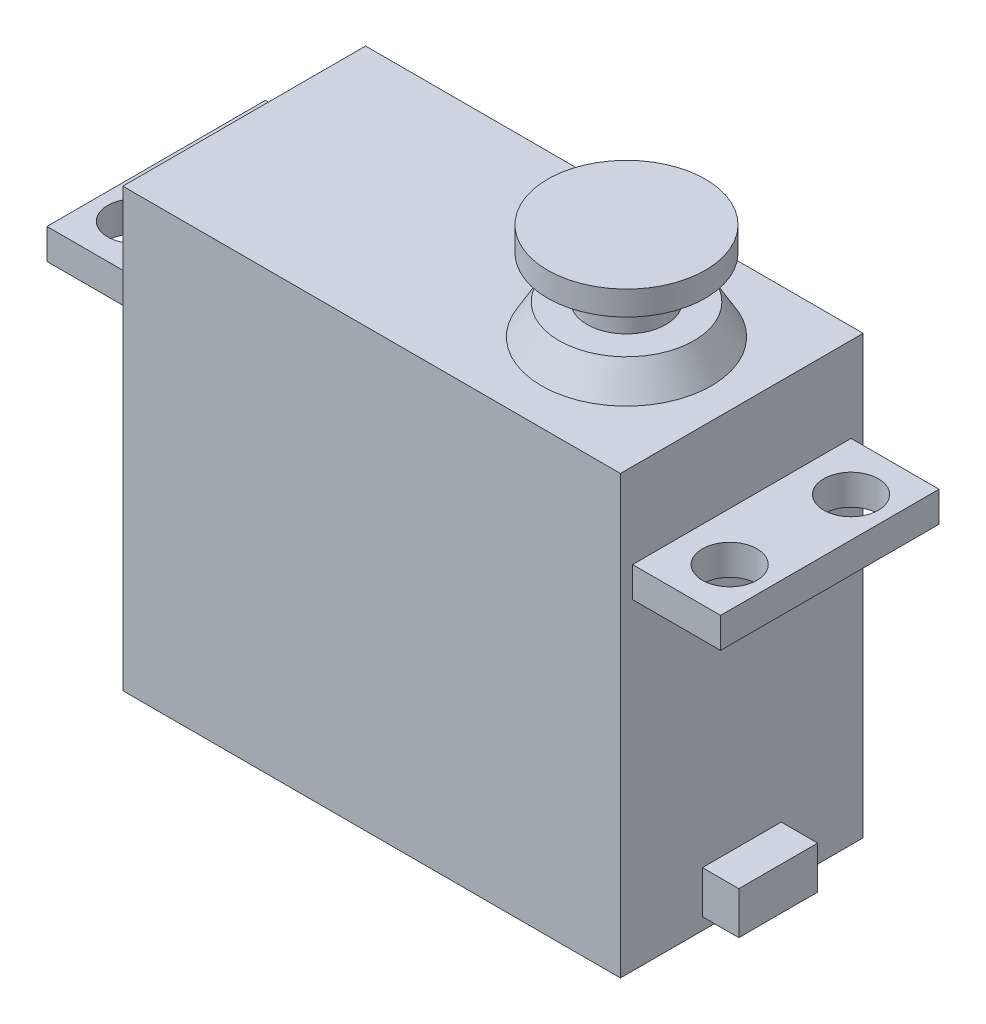
ISO-10303-21;
HEADER;
FILE_DESCRIPTION(('STEP AP214'),'2;1');
FILE_NAME('part.step','',(''),(''),'','','');
FILE_SCHEMA(('AUTOMOTIVE_DESIGN { 1 0 10303 214 1 1 1 1 }'));
ENDSEC;
DATA;
#1=APPLICATION_CONTEXT('core data for automotive mechanical design processes');
#2=APPLICATION_PROTOCOL_DEFINITION('international standard','automotive_design',2000,#1);
#3=PRODUCT_CONTEXT('',#1,'mechanical');
#4=PRODUCT('Part','Part','',(#3));
#5=PRODUCT_RELATED_PRODUCT_CATEGORY('part','',(#4));
#6=PRODUCT_DEFINITION_FORMATION('','',#4);
#7=PRODUCT_DEFINITION_CONTEXT('part definition',#1,'design');
#8=PRODUCT_DEFINITION('design','',#6,#7);
#9=PRODUCT_DEFINITION_SHAPE('','',#8);
#10=(LENGTH_UNIT() NAMED_UNIT(*) SI_UNIT(.MILLI.,.METRE.));
#11=(NAMED_UNIT(*) PLANE_ANGLE_UNIT() SI_UNIT($,.RADIAN.));
#12=(NAMED_UNIT(*) SI_UNIT($,.STERADIAN.) SOLID_ANGLE_UNIT());
#13=UNCERTAINTY_MEASURE_WITH_UNIT(LENGTH_MEASURE(1.E-05),#10,'distance_accuracy_value','');
#14=(GEOMETRIC_REPRESENTATION_CONTEXT(3) GLOBAL_UNCERTAINTY_ASSIGNED_CONTEXT((#13)) GLOBAL_UNIT_ASSIGNED_CONTEXT((#10,
#11,#12)) REPRESENTATION_CONTEXT('',''));
#15=CARTESIAN_POINT('',(0.,0.,0.));
#16=DIRECTION('',(0.,0.,1.));
#17=DIRECTION('',(1.,0.,0.));
#18=AXIS2_PLACEMENT_3D('',#15,#16,#17);
#19=CARTESIAN_POINT('',(11.,44.,0.));
#20=DIRECTION('',(0.,-1.,0.));
#21=DIRECTION('',(0.,0.,-1.));
#22=AXIS2_PLACEMENT_3D('',#19,#20,#21);
#23=CYLINDRICAL_SURFACE('',#22,3.25);
#24=CARTESIAN_POINT('',(11.,38.5,0.));
#25=DIRECTION('',(0.,1.,0.));
#26=DIRECTION('',(0.,0.,1.));
#27=AXIS2_PLACEMENT_3D('',#24,#25,#26);
#28=CIRCLE('',#27,3.25);
#29=CARTESIAN_POINT('',(11.,38.5,3.25));
#30=VERTEX_POINT('',#29);
#31=EDGE_CURVE('E269',#30,#30,#28,.F.);
#32=ORIENTED_EDGE('',*,*,#31,.F.);
#33=EDGE_LOOP('',(#32));
#34=FACE_BOUND('',#33,.T.);
#35=CARTESIAN_POINT('',(11.,42.,0.));
#36=DIRECTION('',(0.,1.,0.));
#37=DIRECTION('',(0.,0.,1.));
#38=AXIS2_PLACEMENT_3D('',#35,#36,#37);
#39=CIRCLE('',#38,3.25);
#40=CARTESIAN_POINT('',(11.,42.,3.25));
#41=VERTEX_POINT('',#40);
#42=EDGE_CURVE('E11',#41,#41,#39,.T.);
#43=ORIENTED_EDGE('',*,*,#42,.F.);
#44=EDGE_LOOP('',(#43));
#45=FACE_BOUND('',#44,.T.);
#46=ADVANCED_FACE('F38',(#34,#45),#23,.T.);
#47=CARTESIAN_POINT('',(20.5,36.,10.));
#48=DIRECTION('',(-1.,0.,0.));
#49=DIRECTION('',(0.,0.,1.));
#50=AXIS2_PLACEMENT_3D('',#47,#48,#49);
#51=PLANE('',#50);
#52=DIRECTION('',(0.,0.,1.));
#53=VECTOR('',#52,1.);
#54=CARTESIAN_POINT('',(20.5,29.,10.));
#55=LINE('',#54,#53);
#56=CARTESIAN_POINT('',(20.5,29.,-9.));
#57=VERTEX_POINT('',#56);
#58=CARTESIAN_POINT('',(20.5,29.,9.));
#59=VERTEX_POINT('',#58);
#60=EDGE_CURVE('E219',#57,#59,#55,.T.);
#61=ORIENTED_EDGE('',*,*,#60,.F.);
#62=DIRECTION('',(0.,-1.,0.));
#63=VECTOR('',#62,1.);
#64=CARTESIAN_POINT('',(20.5,36.,-9.));
#65=LINE('',#64,#63);
#66=CARTESIAN_POINT('',(20.5,26.5,-9.));
#67=VERTEX_POINT('',#66);
#68=EDGE_CURVE('E224',#57,#67,#65,.T.);
#69=ORIENTED_EDGE('',*,*,#68,.T.);
#70=DIRECTION('',(0.,0.,1.));
#71=VECTOR('',#70,1.);
#72=CARTESIAN_POINT('',(20.5,26.5,10.));
#73=LINE('',#72,#71);
#74=CARTESIAN_POINT('',(20.5,26.5,9.));
#75=VERTEX_POINT('',#74);
#76=EDGE_CURVE('E210',#67,#75,#73,.T.);
#77=ORIENTED_EDGE('',*,*,#76,.T.);
#78=DIRECTION('',(0.,1.,0.));
#79=VECTOR('',#78,1.);
#80=CARTESIAN_POINT('',(20.5,36.,9.));
#81=LINE('',#80,#79);
#82=EDGE_CURVE('E221',#75,#59,#81,.T.);
#83=ORIENTED_EDGE('',*,*,#82,.T.);
#84=EDGE_LOOP('',(#61,#69,#77,#83));
#85=FACE_BOUND('',#84,.T.);
#86=DIRECTION('',(0.,0.,-1.));
#87=VECTOR('',#86,1.);
#88=CARTESIAN_POINT('',(20.5,0.,10.));
#89=LINE('',#88,#87);
#90=CARTESIAN_POINT('',(20.5,0.,10.));
#91=VERTEX_POINT('',#90);
#92=CARTESIAN_POINT('',(20.5,0.,-10.));
#93=VERTEX_POINT('',#92);
#94=EDGE_CURVE('E243',#91,#93,#89,.T.);
#95=ORIENTED_EDGE('',*,*,#94,.T.);
#96=DIRECTION('',(0.,-1.,0.));
#97=VECTOR('',#96,1.);
#98=CARTESIAN_POINT('',(20.5,36.,-10.));
#99=LINE('',#98,#97);
#100=CARTESIAN_POINT('',(20.5,36.,-10.));
#101=VERTEX_POINT('',#100);
#102=EDGE_CURVE('E254',#101,#93,#99,.T.);
#103=ORIENTED_EDGE('',*,*,#102,.F.);
#104=DIRECTION('',(0.,0.,-1.));
#105=VECTOR('',#104,1.);
#106=CARTESIAN_POINT('',(20.5,36.,10.));
#107=LINE('',#106,#105);
#108=CARTESIAN_POINT('',(20.5,36.,10.));
#109=VERTEX_POINT('',#108);
#110=EDGE_CURVE('E231',#109,#101,#107,.T.);
#111=ORIENTED_EDGE('',*,*,#110,.F.);
#112=DIRECTION('',(0.,-1.,0.));
#113=VECTOR('',#112,1.);
#114=CARTESIAN_POINT('',(20.5,36.,10.));
#115=LINE('',#114,#113);
#116=EDGE_CURVE('E256',#109,#91,#115,.T.);
#117=ORIENTED_EDGE('',*,*,#116,.T.);
#118=EDGE_LOOP('',(#95,#103,#111,#117));
#119=FACE_BOUND('',#118,.T.);
#120=DIRECTION('',(0.,1.,0.));
#121=VECTOR('',#120,1.);
#122=CARTESIAN_POINT('',(20.5,1.,-3.25));
#123=LINE('',#122,#121);
#124=CARTESIAN_POINT('',(20.5,1.,-3.25));
#125=VERTEX_POINT('',#124);
#126=CARTESIAN_POINT('',(20.5,4.5,-3.25));
#127=VERTEX_POINT('',#126);
#128=EDGE_CURVE('E173',#125,#127,#123,.T.);
#129=ORIENTED_EDGE('',*,*,#128,.F.);
#130=DIRECTION('',(0.,0.,-1.));
#131=VECTOR('',#130,1.);
#132=CARTESIAN_POINT('',(20.5,1.,3.25));
#133=LINE('',#132,#131);
#134=CARTESIAN_POINT('',(20.5,1.,3.25));
#135=VERTEX_POINT('',#134);
#136=EDGE_CURVE('E170',#135,#125,#133,.T.);
#137=ORIENTED_EDGE('',*,*,#136,.F.);
#138=DIRECTION('',(0.,-1.,0.));
#139=VECTOR('',#138,1.);
#140=CARTESIAN_POINT('',(20.5,1.,3.25));
#141=LINE('',#140,#139);
#142=CARTESIAN_POINT('',(20.5,4.5,3.25));
#143=VERTEX_POINT('',#142);
#144=EDGE_CURVE('E60',#143,#135,#141,.T.);
#145=ORIENTED_EDGE('',*,*,#144,.F.);
#146=DIRECTION('',(0.,0.,1.));
#147=VECTOR('',#146,1.);
#148=CARTESIAN_POINT('',(20.5,4.5,3.25));
#149=LINE('',#148,#147);
#150=EDGE_CURVE('E55',#127,#143,#149,.T.);
#151=ORIENTED_EDGE('',*,*,#150,.F.);
#152=EDGE_LOOP('',(#129,#137,#145,#151));
#153=FACE_BOUND('',#152,.T.);
#154=ADVANCED_FACE('F324',(#85,#119,#153),#51,.F.);
#155=CARTESIAN_POINT('',(-20.5,36.,10.));
#156=DIRECTION('',(-1.,0.,0.));
#157=DIRECTION('',(0.,0.,1.));
#158=AXIS2_PLACEMENT_3D('',#155,#156,#157);
#159=PLANE('',#158);
#160=DIRECTION('',(0.,0.,-1.));
#161=VECTOR('',#160,1.);
#162=CARTESIAN_POINT('',(-20.5,0.,10.));
#163=LINE('',#162,#161);
#164=CARTESIAN_POINT('',(-20.5,0.,10.));
#165=VERTEX_POINT('',#164);
#166=CARTESIAN_POINT('',(-20.5,0.,-10.));
#167=VERTEX_POINT('',#166);
#168=EDGE_CURVE('E232',#165,#167,#163,.T.);
#169=ORIENTED_EDGE('',*,*,#168,.F.);
#170=DIRECTION('',(0.,-1.,0.));
#171=VECTOR('',#170,1.);
#172=CARTESIAN_POINT('',(-20.5,36.,10.));
#173=LINE('',#172,#171);
#174=CARTESIAN_POINT('',(-20.5,36.,10.));
#175=VERTEX_POINT('',#174);
#176=EDGE_CURVE('E240',#175,#165,#173,.T.);
#177=ORIENTED_EDGE('',*,*,#176,.F.);
#178=DIRECTION('',(0.,0.,-1.));
#179=VECTOR('',#178,1.);
#180=CARTESIAN_POINT('',(-20.5,36.,10.));
#181=LINE('',#180,#179);
#182=CARTESIAN_POINT('',(-20.5,36.,-10.));
#183=VERTEX_POINT('',#182);
#184=EDGE_CURVE('E237',#175,#183,#181,.T.);
#185=ORIENTED_EDGE('',*,*,#184,.T.);
#186=DIRECTION('',(0.,-1.,0.));
#187=VECTOR('',#186,1.);
#188=CARTESIAN_POINT('',(-20.5,36.,-10.));
#189=LINE('',#188,#187);
#190=EDGE_CURVE('E252',#183,#167,#189,.T.);
#191=ORIENTED_EDGE('',*,*,#190,.T.);
#192=EDGE_LOOP('',(#169,#177,#185,#191));
#193=FACE_BOUND('',#192,.T.);
#194=DIRECTION('',(0.,-1.,0.));
#195=VECTOR('',#194,1.);
#196=CARTESIAN_POINT('',(-20.5,36.,-9.));
#197=LINE('',#196,#195);
#198=CARTESIAN_POINT('',(-20.5,29.,-9.));
#199=VERTEX_POINT('',#198);
#200=CARTESIAN_POINT('',(-20.5,26.5,-9.));
#201=VERTEX_POINT('',#200);
#202=EDGE_CURVE('E265',#199,#201,#197,.T.);
#203=ORIENTED_EDGE('',*,*,#202,.F.);
#204=DIRECTION('',(0.,0.,1.));
#205=VECTOR('',#204,1.);
#206=CARTESIAN_POINT('',(-20.5,29.,10.));
#207=LINE('',#206,#205);
#208=CARTESIAN_POINT('',(-20.5,29.,9.));
#209=VERTEX_POINT('',#208);
#210=EDGE_CURVE('E47',#199,#209,#207,.T.);
#211=ORIENTED_EDGE('',*,*,#210,.T.);
#212=DIRECTION('',(0.,1.,0.));
#213=VECTOR('',#212,1.);
#214=CARTESIAN_POINT('',(-20.5,36.,9.));
#215=LINE('',#214,#213);
#216=CARTESIAN_POINT('',(-20.5,26.5,9.));
#217=VERTEX_POINT('',#216);
#218=EDGE_CURVE('E262',#217,#209,#215,.T.);
#219=ORIENTED_EDGE('',*,*,#218,.F.);
#220=DIRECTION('',(0.,0.,1.));
#221=VECTOR('',#220,1.);
#222=CARTESIAN_POINT('',(-20.5,26.5,10.));
#223=LINE('',#222,#221);
#224=EDGE_CURVE('E259',#201,#217,#223,.T.);
#225=ORIENTED_EDGE('',*,*,#224,.F.);
#226=EDGE_LOOP('',(#203,#211,#219,#225));
#227=FACE_BOUND('',#226,.T.);
#228=ADVANCED_FACE('F330',(#193,#227),#159,.T.);
#229=CARTESIAN_POINT('',(-20.5,36.,10.));
#230=DIRECTION('',(0.,0.,-1.));
#231=DIRECTION('',(-1.,0.,0.));
#232=AXIS2_PLACEMENT_3D('',#229,#230,#231);
#233=PLANE('',#232);
#234=DIRECTION('',(1.,0.,0.));
#235=VECTOR('',#234,1.);
#236=CARTESIAN_POINT('',(-20.5,0.,10.));
#237=LINE('',#236,#235);
#238=EDGE_CURVE('E227',#165,#91,#237,.T.);
#239=ORIENTED_EDGE('',*,*,#238,.T.);
#240=ORIENTED_EDGE('',*,*,#116,.F.);
#241=DIRECTION('',(1.,0.,0.));
#242=VECTOR('',#241,1.);
#243=CARTESIAN_POINT('',(-20.5,36.,10.));
#244=LINE('',#243,#242);
#245=EDGE_CURVE('E228',#175,#109,#244,.T.);
#246=ORIENTED_EDGE('',*,*,#245,.F.);
#247=ORIENTED_EDGE('',*,*,#176,.T.);
#248=EDGE_LOOP('',(#239,#240,#246,#247));
#249=FACE_BOUND('',#248,.T.);
#250=ADVANCED_FACE('F40',(#249),#233,.F.);
#251=CARTESIAN_POINT('',(-20.5,36.,-10.));
#252=DIRECTION('',(0.,0.,-1.));
#253=DIRECTION('',(-1.,0.,0.));
#254=AXIS2_PLACEMENT_3D('',#251,#252,#253);
#255=PLANE('',#254);
#256=DIRECTION('',(1.,0.,0.));
#257=VECTOR('',#256,1.);
#258=CARTESIAN_POINT('',(-20.5,0.,-10.));
#259=LINE('',#258,#257);
#260=EDGE_CURVE('E246',#167,#93,#259,.T.);
#261=ORIENTED_EDGE('',*,*,#260,.F.);
#262=ORIENTED_EDGE('',*,*,#190,.F.);
#263=DIRECTION('',(1.,0.,0.));
#264=VECTOR('',#263,1.);
#265=CARTESIAN_POINT('',(-20.5,36.,-10.));
#266=LINE('',#265,#264);
#267=EDGE_CURVE('E234',#183,#101,#266,.T.);
#268=ORIENTED_EDGE('',*,*,#267,.T.);
#269=ORIENTED_EDGE('',*,*,#102,.T.);
#270=EDGE_LOOP('',(#261,#262,#268,#269));
#271=FACE_BOUND('',#270,.T.);
#272=ADVANCED_FACE('F574',(#271),#255,.T.);
#273=CARTESIAN_POINT('',(0.,36.,0.));
#274=DIRECTION('',(0.,1.,0.));
#275=DIRECTION('',(0.,0.,1.));
#276=AXIS2_PLACEMENT_3D('',#273,#274,#275);
#277=PLANE('',#276);
#278=CARTESIAN_POINT('',(11.,36.,0.));
#279=DIRECTION('',(0.,1.,0.));
#280=DIRECTION('',(0.,0.,1.));
#281=AXIS2_PLACEMENT_3D('',#278,#279,#280);
#282=CIRCLE('',#281,7.);
#283=CARTESIAN_POINT('',(11.,36.,7.));
#284=VERTEX_POINT('',#283);
#285=EDGE_CURVE('E271',#284,#284,#282,.T.);
#286=ORIENTED_EDGE('',*,*,#285,.F.);
#287=EDGE_LOOP('',(#286));
#288=FACE_BOUND('',#287,.T.);
#289=ORIENTED_EDGE('',*,*,#245,.T.);
#290=ORIENTED_EDGE('',*,*,#110,.T.);
#291=ORIENTED_EDGE('',*,*,#267,.F.);
#292=ORIENTED_EDGE('',*,*,#184,.F.);
#293=EDGE_LOOP('',(#289,#290,#291,#292));
#294=FACE_BOUND('',#293,.T.);
#295=ADVANCED_FACE('F565',(#288,#294),#277,.T.);
#296=CARTESIAN_POINT('',(0.,0.,0.));
#297=DIRECTION('',(0.,1.,0.));
#298=DIRECTION('',(0.,0.,1.));
#299=AXIS2_PLACEMENT_3D('',#296,#297,#298);
#300=PLANE('',#299);
#301=ORIENTED_EDGE('',*,*,#238,.F.);
#302=ORIENTED_EDGE('',*,*,#168,.T.);
#303=ORIENTED_EDGE('',*,*,#260,.T.);
#304=ORIENTED_EDGE('',*,*,#94,.F.);
#305=EDGE_LOOP('',(#301,#302,#303,#304));
#306=FACE_BOUND('',#305,.T.);
#307=ADVANCED_FACE('F548',(#306),#300,.F.);
#308=CARTESIAN_POINT('',(-27.75,29.,9.));
#309=DIRECTION('',(-1.,0.,0.));
#310=DIRECTION('',(0.,0.,1.));
#311=AXIS2_PLACEMENT_3D('',#308,#309,#310);
#312=PLANE('',#311);
#313=DIRECTION('',(0.,0.,-1.));
#314=VECTOR('',#313,1.);
#315=CARTESIAN_POINT('',(-27.75,26.5,9.));
#316=LINE('',#315,#314);
#317=CARTESIAN_POINT('',(-27.75,26.5,9.));
#318=VERTEX_POINT('',#317);
#319=CARTESIAN_POINT('',(-27.75,26.5,-9.));
#320=VERTEX_POINT('',#319);
#321=EDGE_CURVE('E201',#318,#320,#316,.T.);
#322=ORIENTED_EDGE('',*,*,#321,.F.);
#323=DIRECTION('',(0.,-1.,0.));
#324=VECTOR('',#323,1.);
#325=CARTESIAN_POINT('',(-27.75,29.,9.));
#326=LINE('',#325,#324);
#327=CARTESIAN_POINT('',(-27.75,29.,9.));
#328=VERTEX_POINT('',#327);
#329=EDGE_CURVE('E213',#328,#318,#326,.T.);
#330=ORIENTED_EDGE('',*,*,#329,.F.);
#331=DIRECTION('',(0.,0.,-1.));
#332=VECTOR('',#331,1.);
#333=CARTESIAN_POINT('',(-27.75,29.,9.));
#334=LINE('',#333,#332);
#335=CARTESIAN_POINT('',(-27.75,29.,-9.));
#336=VERTEX_POINT('',#335);
#337=EDGE_CURVE('E191',#328,#336,#334,.T.);
#338=ORIENTED_EDGE('',*,*,#337,.T.);
#339=DIRECTION('',(0.,-1.,0.));
#340=VECTOR('',#339,1.);
#341=CARTESIAN_POINT('',(-27.75,29.,-9.));
#342=LINE('',#341,#340);
#343=EDGE_CURVE('E211',#336,#320,#342,.T.);
#344=ORIENTED_EDGE('',*,*,#343,.T.);
#345=EDGE_LOOP('',(#322,#330,#338,#344));
#346=FACE_BOUND('',#345,.T.);
#347=ADVANCED_FACE('F541',(#346),#312,.T.);
#348=CARTESIAN_POINT('',(0.,29.,0.));
#349=DIRECTION('',(0.,-1.,0.));
#350=DIRECTION('',(0.,0.,-1.));
#351=AXIS2_PLACEMENT_3D('',#348,#349,#350);
#352=PLANE('',#351);
#353=CARTESIAN_POINT('',(-24.5,29.,5.));
#354=DIRECTION('',(0.,1.,0.));
#355=DIRECTION('',(0.,0.,-1.));
#356=AXIS2_PLACEMENT_3D('',#353,#354,#355);
#357=CIRCLE('',#356,2.25);
#358=CARTESIAN_POINT('',(-24.5,29.,2.75));
#359=VERTEX_POINT('',#358);
#360=EDGE_CURVE('E635',#359,#359,#357,.T.);
#361=ORIENTED_EDGE('',*,*,#360,.F.);
#362=EDGE_LOOP('',(#361));
#363=FACE_BOUND('',#362,.T.);
#364=CARTESIAN_POINT('',(-24.5,29.,-5.));
#365=DIRECTION('',(0.,1.,0.));
#366=DIRECTION('',(0.,0.,1.));
#367=AXIS2_PLACEMENT_3D('',#364,#365,#366);
#368=CIRCLE('',#367,2.25);
#369=CARTESIAN_POINT('',(-24.5,29.,-2.75));
#370=VERTEX_POINT('',#369);
#371=EDGE_CURVE('E278',#370,#370,#368,.T.);
#372=ORIENTED_EDGE('',*,*,#371,.F.);
#373=EDGE_LOOP('',(#372));
#374=FACE_BOUND('',#373,.T.);
#375=ORIENTED_EDGE('',*,*,#210,.F.);
#376=DIRECTION('',(1.,0.,0.));
#377=VECTOR('',#376,1.);
#378=CARTESIAN_POINT('',(-27.75,29.,-9.));
#379=LINE('',#378,#377);
#380=EDGE_CURVE('E195',#336,#199,#379,.T.);
#381=ORIENTED_EDGE('',*,*,#380,.F.);
#382=ORIENTED_EDGE('',*,*,#337,.F.);
#383=DIRECTION('',(-1.,0.,0.));
#384=VECTOR('',#383,1.);
#385=CARTESIAN_POINT('',(-27.75,29.,9.));
#386=LINE('',#385,#384);
#387=EDGE_CURVE('E186',#209,#328,#386,.T.);
#388=ORIENTED_EDGE('',*,*,#387,.F.);
#389=EDGE_LOOP('',(#375,#381,#382,#388));
#390=FACE_BOUND('',#389,.T.);
#391=ADVANCED_FACE('F495',(#363,#374,#390),#352,.F.);
#392=CARTESIAN_POINT('',(0.,26.5,0.));
#393=DIRECTION('',(0.,-1.,0.));
#394=DIRECTION('',(0.,0.,-1.));
#395=AXIS2_PLACEMENT_3D('',#392,#393,#394);
#396=PLANE('',#395);
#397=CARTESIAN_POINT('',(-24.5,26.5,5.));
#398=DIRECTION('',(0.,-1.,0.));
#399=DIRECTION('',(0.,0.,-1.));
#400=AXIS2_PLACEMENT_3D('',#397,#398,#399);
#401=CIRCLE('',#400,2.25);
#402=CARTESIAN_POINT('',(-24.5,26.5,2.75));
#403=VERTEX_POINT('',#402);
#404=EDGE_CURVE('E42',#403,#403,#401,.T.);
#405=ORIENTED_EDGE('',*,*,#404,.F.);
#406=EDGE_LOOP('',(#405));
#407=FACE_BOUND('',#406,.T.);
#408=CARTESIAN_POINT('',(-24.5,26.5,-5.));
#409=DIRECTION('',(0.,-1.,0.));
#410=DIRECTION('',(0.,0.,-1.));
#411=AXIS2_PLACEMENT_3D('',#408,#409,#410);
#412=CIRCLE('',#411,2.25);
#413=CARTESIAN_POINT('',(-24.5,26.5,-7.25));
#414=VERTEX_POINT('',#413);
#415=EDGE_CURVE('E280',#414,#414,#412,.T.);
#416=ORIENTED_EDGE('',*,*,#415,.F.);
#417=EDGE_LOOP('',(#416));
#418=FACE_BOUND('',#417,.T.);
#419=DIRECTION('',(1.,0.,0.));
#420=VECTOR('',#419,1.);
#421=CARTESIAN_POINT('',(-27.75,26.5,-9.));
#422=LINE('',#421,#420);
#423=EDGE_CURVE('E187',#320,#201,#422,.T.);
#424=ORIENTED_EDGE('',*,*,#423,.T.);
#425=ORIENTED_EDGE('',*,*,#224,.T.);
#426=DIRECTION('',(-1.,0.,0.));
#427=VECTOR('',#426,1.);
#428=CARTESIAN_POINT('',(-27.75,26.5,9.));
#429=LINE('',#428,#427);
#430=EDGE_CURVE('E177',#217,#318,#429,.T.);
#431=ORIENTED_EDGE('',*,*,#430,.T.);
#432=ORIENTED_EDGE('',*,*,#321,.T.);
#433=EDGE_LOOP('',(#424,#425,#431,#432));
#434=FACE_BOUND('',#433,.T.);
#435=ADVANCED_FACE('F485',(#407,#418,#434),#396,.T.);
#436=CARTESIAN_POINT('',(-27.75,29.,9.));
#437=DIRECTION('',(0.,0.,1.));
#438=DIRECTION('',(1.,0.,0.));
#439=AXIS2_PLACEMENT_3D('',#436,#437,#438);
#440=PLANE('',#439);
#441=ORIENTED_EDGE('',*,*,#430,.F.);
#442=ORIENTED_EDGE('',*,*,#218,.T.);
#443=ORIENTED_EDGE('',*,*,#387,.T.);
#444=ORIENTED_EDGE('',*,*,#329,.T.);
#445=EDGE_LOOP('',(#441,#442,#443,#444));
#446=FACE_BOUND('',#445,.T.);
#447=ADVANCED_FACE('F505',(#446),#440,.T.);
#448=CARTESIAN_POINT('',(-27.75,29.,-9.));
#449=DIRECTION('',(0.,0.,-1.));
#450=DIRECTION('',(-1.,0.,0.));
#451=AXIS2_PLACEMENT_3D('',#448,#449,#450);
#452=PLANE('',#451);
#453=ORIENTED_EDGE('',*,*,#380,.T.);
#454=ORIENTED_EDGE('',*,*,#202,.T.);
#455=ORIENTED_EDGE('',*,*,#423,.F.);
#456=ORIENTED_EDGE('',*,*,#343,.F.);
#457=EDGE_LOOP('',(#453,#454,#455,#456));
#458=FACE_BOUND('',#457,.T.);
#459=ADVANCED_FACE('F512',(#458),#452,.T.);
#460=ORIENTED_EDGE('',*,*,#68,.F.);
#461=CARTESIAN_POINT('',(27.75,29.,-9.));
#462=VERTEX_POINT('',#461);
#463=EDGE_CURVE('E194',#57,#462,#379,.T.);
#464=ORIENTED_EDGE('',*,*,#463,.T.);
#465=DIRECTION('',(0.,-1.,0.));
#466=VECTOR('',#465,1.);
#467=CARTESIAN_POINT('',(27.75,29.,-9.));
#468=LINE('',#467,#466);
#469=CARTESIAN_POINT('',(27.75,26.5,-9.));
#470=VERTEX_POINT('',#469);
#471=EDGE_CURVE('E207',#462,#470,#468,.T.);
#472=ORIENTED_EDGE('',*,*,#471,.T.);
#473=EDGE_CURVE('E204',#67,#470,#422,.T.);
#474=ORIENTED_EDGE('',*,*,#473,.F.);
#475=EDGE_LOOP('',(#460,#464,#472,#474));
#476=FACE_BOUND('',#475,.T.);
#477=ADVANCED_FACE('F502',(#476),#452,.T.);
#478=ORIENTED_EDGE('',*,*,#82,.F.);
#479=CARTESIAN_POINT('',(27.75,26.5,9.));
#480=VERTEX_POINT('',#479);
#481=EDGE_CURVE('E199',#480,#75,#429,.T.);
#482=ORIENTED_EDGE('',*,*,#481,.F.);
#483=DIRECTION('',(0.,-1.,0.));
#484=VECTOR('',#483,1.);
#485=CARTESIAN_POINT('',(27.75,29.,9.));
#486=LINE('',#485,#484);
#487=CARTESIAN_POINT('',(27.75,29.,9.));
#488=VERTEX_POINT('',#487);
#489=EDGE_CURVE('E197',#488,#480,#486,.T.);
#490=ORIENTED_EDGE('',*,*,#489,.F.);
#491=EDGE_CURVE('E188',#488,#59,#386,.T.);
#492=ORIENTED_EDGE('',*,*,#491,.T.);
#493=EDGE_LOOP('',(#478,#482,#490,#492));
#494=FACE_BOUND('',#493,.T.);
#495=ADVANCED_FACE('F492',(#494),#440,.T.);
#496=CARTESIAN_POINT('',(24.5,29.,-5.));
#497=DIRECTION('',(0.,1.,0.));
#498=DIRECTION('',(0.,0.,-1.));
#499=AXIS2_PLACEMENT_3D('',#496,#497,#498);
#500=CIRCLE('',#499,2.25);
#501=CARTESIAN_POINT('',(24.5,29.,-7.25));
#502=VERTEX_POINT('',#501);
#503=EDGE_CURVE('E639',#502,#502,#500,.T.);
#504=ORIENTED_EDGE('',*,*,#503,.F.);
#505=EDGE_LOOP('',(#504));
#506=FACE_BOUND('',#505,.T.);
#507=CARTESIAN_POINT('',(24.5,29.,5.));
#508=DIRECTION('',(0.,1.,0.));
#509=DIRECTION('',(0.,0.,1.));
#510=AXIS2_PLACEMENT_3D('',#507,#508,#509);
#511=CIRCLE('',#510,2.25);
#512=CARTESIAN_POINT('',(24.5,29.,7.25));
#513=VERTEX_POINT('',#512);
#514=EDGE_CURVE('E643',#513,#513,#511,.T.);
#515=ORIENTED_EDGE('',*,*,#514,.F.);
#516=EDGE_LOOP('',(#515));
#517=FACE_BOUND('',#516,.T.);
#518=ORIENTED_EDGE('',*,*,#463,.F.);
#519=ORIENTED_EDGE('',*,*,#60,.T.);
#520=ORIENTED_EDGE('',*,*,#491,.F.);
#521=DIRECTION('',(0.,0.,1.));
#522=VECTOR('',#521,1.);
#523=CARTESIAN_POINT('',(27.75,29.,9.));
#524=LINE('',#523,#522);
#525=EDGE_CURVE('E183',#462,#488,#524,.T.);
#526=ORIENTED_EDGE('',*,*,#525,.F.);
#527=EDGE_LOOP('',(#518,#519,#520,#526));
#528=FACE_BOUND('',#527,.T.);
#529=ADVANCED_FACE('F482',(#506,#517,#528),#352,.F.);
#530=CARTESIAN_POINT('',(24.5,26.5,-5.));
#531=DIRECTION('',(0.,-1.,0.));
#532=DIRECTION('',(0.,0.,-1.));
#533=AXIS2_PLACEMENT_3D('',#530,#531,#532);
#534=CIRCLE('',#533,2.25);
#535=CARTESIAN_POINT('',(24.5,26.5,-7.25));
#536=VERTEX_POINT('',#535);
#537=EDGE_CURVE('E277',#536,#536,#534,.T.);
#538=ORIENTED_EDGE('',*,*,#537,.F.);
#539=EDGE_LOOP('',(#538));
#540=FACE_BOUND('',#539,.T.);
#541=CARTESIAN_POINT('',(24.5,26.5,5.));
#542=DIRECTION('',(0.,-1.,0.));
#543=DIRECTION('',(0.,0.,-1.));
#544=AXIS2_PLACEMENT_3D('',#541,#542,#543);
#545=CIRCLE('',#544,2.25);
#546=CARTESIAN_POINT('',(24.5,26.5,2.75));
#547=VERTEX_POINT('',#546);
#548=EDGE_CURVE('E274',#547,#547,#545,.T.);
#549=ORIENTED_EDGE('',*,*,#548,.F.);
#550=EDGE_LOOP('',(#549));
#551=FACE_BOUND('',#550,.T.);
#552=ORIENTED_EDGE('',*,*,#76,.F.);
#553=ORIENTED_EDGE('',*,*,#473,.T.);
#554=DIRECTION('',(0.,0.,1.));
#555=VECTOR('',#554,1.);
#556=CARTESIAN_POINT('',(27.75,26.5,9.));
#557=LINE('',#556,#555);
#558=EDGE_CURVE('E174',#470,#480,#557,.T.);
#559=ORIENTED_EDGE('',*,*,#558,.T.);
#560=ORIENTED_EDGE('',*,*,#481,.T.);
#561=EDGE_LOOP('',(#552,#553,#559,#560));
#562=FACE_BOUND('',#561,.T.);
#563=ADVANCED_FACE('F473',(#540,#551,#562),#396,.T.);
#564=CARTESIAN_POINT('',(27.75,29.,9.));
#565=DIRECTION('',(1.,0.,0.));
#566=DIRECTION('',(0.,0.,-1.));
#567=AXIS2_PLACEMENT_3D('',#564,#565,#566);
#568=PLANE('',#567);
#569=ORIENTED_EDGE('',*,*,#558,.F.);
#570=ORIENTED_EDGE('',*,*,#471,.F.);
#571=ORIENTED_EDGE('',*,*,#525,.T.);
#572=ORIENTED_EDGE('',*,*,#489,.T.);
#573=EDGE_LOOP('',(#569,#570,#571,#572));
#574=FACE_BOUND('',#573,.T.);
#575=ADVANCED_FACE('F460',(#574),#568,.T.);
#576=CARTESIAN_POINT('',(23.5,1.,-3.25));
#577=DIRECTION('',(0.,0.,1.));
#578=DIRECTION('',(0.,-1.,0.));
#579=AXIS2_PLACEMENT_3D('',#576,#577,#578);
#580=PLANE('',#579);
#581=ORIENTED_EDGE('',*,*,#128,.T.);
#582=DIRECTION('',(-1.,0.,0.));
#583=VECTOR('',#582,1.);
#584=CARTESIAN_POINT('',(23.5,4.5,-3.25));
#585=LINE('',#584,#583);
#586=CARTESIAN_POINT('',(23.5,4.5,-3.25));
#587=VERTEX_POINT('',#586);
#588=EDGE_CURVE('E154',#587,#127,#585,.T.);
#589=ORIENTED_EDGE('',*,*,#588,.F.);
#590=DIRECTION('',(0.,1.,0.));
#591=VECTOR('',#590,1.);
#592=CARTESIAN_POINT('',(23.5,1.,-3.25));
#593=LINE('',#592,#591);
#594=CARTESIAN_POINT('',(23.5,1.,-3.25));
#595=VERTEX_POINT('',#594);
#596=EDGE_CURVE('E161',#595,#587,#593,.T.);
#597=ORIENTED_EDGE('',*,*,#596,.F.);
#598=DIRECTION('',(-1.,0.,0.));
#599=VECTOR('',#598,1.);
#600=CARTESIAN_POINT('',(23.5,1.,-3.25));
#601=LINE('',#600,#599);
#602=EDGE_CURVE('E303',#595,#125,#601,.T.);
#603=ORIENTED_EDGE('',*,*,#602,.T.);
#604=EDGE_LOOP('',(#581,#589,#597,#603));
#605=FACE_BOUND('',#604,.T.);
#606=ADVANCED_FACE('F172',(#605),#580,.F.);
#607=CARTESIAN_POINT('',(23.5,4.5,3.25));
#608=DIRECTION('',(0.,-1.,0.));
#609=DIRECTION('',(0.,0.,-1.));
#610=AXIS2_PLACEMENT_3D('',#607,#608,#609);
#611=PLANE('',#610);
#612=ORIENTED_EDGE('',*,*,#150,.T.);
#613=DIRECTION('',(-1.,0.,0.));
#614=VECTOR('',#613,1.);
#615=CARTESIAN_POINT('',(23.5,4.5,3.25));
#616=LINE('',#615,#614);
#617=CARTESIAN_POINT('',(23.5,4.5,3.25));
#618=VERTEX_POINT('',#617);
#619=EDGE_CURVE('E157',#618,#143,#616,.T.);
#620=ORIENTED_EDGE('',*,*,#619,.F.);
#621=DIRECTION('',(0.,0.,1.));
#622=VECTOR('',#621,1.);
#623=CARTESIAN_POINT('',(23.5,4.5,3.25));
#624=LINE('',#623,#622);
#625=EDGE_CURVE('E150',#587,#618,#624,.T.);
#626=ORIENTED_EDGE('',*,*,#625,.F.);
#627=ORIENTED_EDGE('',*,*,#588,.T.);
#628=EDGE_LOOP('',(#612,#620,#626,#627));
#629=FACE_BOUND('',#628,.T.);
#630=ADVANCED_FACE('F152',(#629),#611,.F.);
#631=CARTESIAN_POINT('',(23.5,1.,3.25));
#632=DIRECTION('',(0.,0.,-1.));
#633=DIRECTION('',(0.,1.,0.));
#634=AXIS2_PLACEMENT_3D('',#631,#632,#633);
#635=PLANE('',#634);
#636=ORIENTED_EDGE('',*,*,#144,.T.);
#637=DIRECTION('',(-1.,0.,0.));
#638=VECTOR('',#637,1.);
#639=CARTESIAN_POINT('',(23.5,1.,3.25));
#640=LINE('',#639,#638);
#641=CARTESIAN_POINT('',(23.5,1.,3.25));
#642=VERTEX_POINT('',#641);
#643=EDGE_CURVE('E179',#642,#135,#640,.T.);
#644=ORIENTED_EDGE('',*,*,#643,.F.);
#645=DIRECTION('',(0.,-1.,0.));
#646=VECTOR('',#645,1.);
#647=CARTESIAN_POINT('',(23.5,1.,3.25));
#648=LINE('',#647,#646);
#649=EDGE_CURVE('E160',#618,#642,#648,.T.);
#650=ORIENTED_EDGE('',*,*,#649,.F.);
#651=ORIENTED_EDGE('',*,*,#619,.T.);
#652=EDGE_LOOP('',(#636,#644,#650,#651));
#653=FACE_BOUND('',#652,.T.);
#654=ADVANCED_FACE('F314',(#653),#635,.F.);
#655=CARTESIAN_POINT('',(23.5,1.,3.25));
#656=DIRECTION('',(0.,1.,0.));
#657=DIRECTION('',(0.,0.,1.));
#658=AXIS2_PLACEMENT_3D('',#655,#656,#657);
#659=PLANE('',#658);
#660=ORIENTED_EDGE('',*,*,#136,.T.);
#661=ORIENTED_EDGE('',*,*,#602,.F.);
#662=DIRECTION('',(0.,0.,-1.));
#663=VECTOR('',#662,1.);
#664=CARTESIAN_POINT('',(23.5,1.,3.25));
#665=LINE('',#664,#663);
#666=EDGE_CURVE('E166',#642,#595,#665,.T.);
#667=ORIENTED_EDGE('',*,*,#666,.F.);
#668=ORIENTED_EDGE('',*,*,#643,.T.);
#669=EDGE_LOOP('',(#660,#661,#667,#668));
#670=FACE_BOUND('',#669,.T.);
#671=ADVANCED_FACE('F312',(#670),#659,.F.);
#672=CARTESIAN_POINT('',(23.5,0.,0.));
#673=DIRECTION('',(-1.,0.,0.));
#674=DIRECTION('',(0.,0.,1.));
#675=AXIS2_PLACEMENT_3D('',#672,#673,#674);
#676=PLANE('',#675);
#677=ORIENTED_EDGE('',*,*,#596,.T.);
#678=ORIENTED_EDGE('',*,*,#625,.T.);
#679=ORIENTED_EDGE('',*,*,#649,.T.);
#680=ORIENTED_EDGE('',*,*,#666,.T.);
#681=EDGE_LOOP('',(#677,#678,#679,#680));
#682=FACE_BOUND('',#681,.T.);
#683=ADVANCED_FACE('F164',(#682),#676,.F.);
#684=CARTESIAN_POINT('',(11.,36.,0.));
#685=DIRECTION('',(0.,-1.,0.));
#686=DIRECTION('',(0.,0.,1.));
#687=AXIS2_PLACEMENT_3D('',#684,#685,#686);
#688=CONICAL_SURFACE('',#687,7.,0.5235987755983);
#689=CARTESIAN_POINT('',(11.,38.5,0.));
#690=DIRECTION('',(0.,1.,0.));
#691=DIRECTION('',(0.,0.,1.));
#692=AXIS2_PLACEMENT_3D('',#689,#690,#691);
#693=CIRCLE('',#692,5.55662432702593);
#694=CARTESIAN_POINT('',(11.,38.5,5.55662432702593));
#695=VERTEX_POINT('',#694);
#696=EDGE_CURVE('E298',#695,#695,#693,.T.);
#697=ORIENTED_EDGE('',*,*,#696,.F.);
#698=EDGE_LOOP('',(#697));
#699=FACE_BOUND('',#698,.T.);
#700=ORIENTED_EDGE('',*,*,#285,.T.);
#701=EDGE_LOOP('',(#700));
#702=FACE_BOUND('',#701,.T.);
#703=ADVANCED_FACE('F342',(#699,#702),#688,.T.);
#704=CARTESIAN_POINT('',(11.,38.5,0.));
#705=DIRECTION('',(0.,1.,0.));
#706=DIRECTION('',(0.,0.,1.));
#707=AXIS2_PLACEMENT_3D('',#704,#705,#706);
#708=PLANE('',#707);
#709=ORIENTED_EDGE('',*,*,#31,.T.);
#710=EDGE_LOOP('',(#709));
#711=FACE_BOUND('',#710,.T.);
#712=ORIENTED_EDGE('',*,*,#696,.T.);
#713=EDGE_LOOP('',(#712));
#714=FACE_BOUND('',#713,.T.);
#715=ADVANCED_FACE('F338',(#711,#714),#708,.T.);
#716=CARTESIAN_POINT('',(11.,42.,0.));
#717=DIRECTION('',(0.,1.,0.));
#718=DIRECTION('',(0.,0.,1.));
#719=AXIS2_PLACEMENT_3D('',#716,#717,#718);
#720=CYLINDRICAL_SURFACE('',#719,6.5);
#721=CARTESIAN_POINT('',(11.,42.,0.));
#722=DIRECTION('',(0.,1.,0.));
#723=DIRECTION('',(0.,0.,1.));
#724=AXIS2_PLACEMENT_3D('',#721,#722,#723);
#725=CIRCLE('',#724,6.5);
#726=CARTESIAN_POINT('',(11.,42.,6.5));
#727=VERTEX_POINT('',#726);
#728=EDGE_CURVE('E272',#727,#727,#725,.T.);
#729=ORIENTED_EDGE('',*,*,#728,.T.);
#730=EDGE_LOOP('',(#729));
#731=FACE_BOUND('',#730,.T.);
#732=CARTESIAN_POINT('',(11.,44.,0.));
#733=DIRECTION('',(0.,1.,0.));
#734=DIRECTION('',(0.,0.,1.));
#735=AXIS2_PLACEMENT_3D('',#732,#733,#734);
#736=CIRCLE('',#735,6.5);
#737=CARTESIAN_POINT('',(11.,44.,6.5));
#738=VERTEX_POINT('',#737);
#739=EDGE_CURVE('E285',#738,#738,#736,.T.);
#740=ORIENTED_EDGE('',*,*,#739,.F.);
#741=EDGE_LOOP('',(#740));
#742=FACE_BOUND('',#741,.T.);
#743=ADVANCED_FACE('F341',(#731,#742),#720,.T.);
#744=CARTESIAN_POINT('',(11.,42.,0.));
#745=DIRECTION('',(0.,1.,0.));
#746=DIRECTION('',(0.,0.,1.));
#747=AXIS2_PLACEMENT_3D('',#744,#745,#746);
#748=PLANE('',#747);
#749=ORIENTED_EDGE('',*,*,#42,.T.);
#750=EDGE_LOOP('',(#749));
#751=FACE_BOUND('',#750,.T.);
#752=ORIENTED_EDGE('',*,*,#728,.F.);
#753=EDGE_LOOP('',(#752));
#754=FACE_BOUND('',#753,.T.);
#755=ADVANCED_FACE('F367',(#751,#754),#748,.F.);
#756=CARTESIAN_POINT('',(11.,44.,0.));
#757=DIRECTION('',(0.,1.,0.));
#758=DIRECTION('',(0.,0.,1.));
#759=AXIS2_PLACEMENT_3D('',#756,#757,#758);
#760=PLANE('',#759);
#761=ORIENTED_EDGE('',*,*,#739,.T.);
#762=EDGE_LOOP('',(#761));
#763=FACE_BOUND('',#762,.T.);
#764=ADVANCED_FACE('F336',(#763),#760,.T.);
#765=CARTESIAN_POINT('',(24.5,19.,5.));
#766=DIRECTION('',(0.,1.,0.));
#767=DIRECTION('',(0.,0.,1.));
#768=AXIS2_PLACEMENT_3D('',#765,#766,#767);
#769=CYLINDRICAL_SURFACE('',#768,2.25);
#770=ORIENTED_EDGE('',*,*,#548,.T.);
#771=EDGE_LOOP('',(#770));
#772=FACE_BOUND('',#771,.T.);
#773=ORIENTED_EDGE('',*,*,#514,.T.);
#774=EDGE_LOOP('',(#773));
#775=FACE_BOUND('',#774,.T.);
#776=ADVANCED_FACE('F381',(#772,#775),#769,.F.);
#777=CARTESIAN_POINT('',(24.5,19.,-5.));
#778=DIRECTION('',(0.,1.,0.));
#779=DIRECTION('',(0.,0.,1.));
#780=AXIS2_PLACEMENT_3D('',#777,#778,#779);
#781=CYLINDRICAL_SURFACE('',#780,2.25);
#782=ORIENTED_EDGE('',*,*,#537,.T.);
#783=EDGE_LOOP('',(#782));
#784=FACE_BOUND('',#783,.T.);
#785=ORIENTED_EDGE('',*,*,#503,.T.);
#786=EDGE_LOOP('',(#785));
#787=FACE_BOUND('',#786,.T.);
#788=ADVANCED_FACE('F388',(#784,#787),#781,.F.);
#789=CARTESIAN_POINT('',(-24.5,19.,-5.));
#790=DIRECTION('',(0.,1.,0.));
#791=DIRECTION('',(0.,0.,1.));
#792=AXIS2_PLACEMENT_3D('',#789,#790,#791);
#793=CYLINDRICAL_SURFACE('',#792,2.25);
#794=ORIENTED_EDGE('',*,*,#415,.T.);
#795=EDGE_LOOP('',(#794));
#796=FACE_BOUND('',#795,.T.);
#797=ORIENTED_EDGE('',*,*,#371,.T.);
#798=EDGE_LOOP('',(#797));
#799=FACE_BOUND('',#798,.T.);
#800=ADVANCED_FACE('F397',(#796,#799),#793,.F.);
#801=CARTESIAN_POINT('',(-24.5,19.,5.));
#802=DIRECTION('',(0.,1.,0.));
#803=DIRECTION('',(0.,0.,1.));
#804=AXIS2_PLACEMENT_3D('',#801,#802,#803);
#805=CYLINDRICAL_SURFACE('',#804,2.25);
#806=ORIENTED_EDGE('',*,*,#404,.T.);
#807=EDGE_LOOP('',(#806));
#808=FACE_BOUND('',#807,.T.);
#809=ORIENTED_EDGE('',*,*,#360,.T.);
#810=EDGE_LOOP('',(#809));
#811=FACE_BOUND('',#810,.T.);
#812=ADVANCED_FACE('F405',(#808,#811),#805,.F.);
#813=CLOSED_SHELL('',(#46,#154,#228,#250,#272,#295,#307,#347,#391,#435,#447,#459,#477,#495,#529,
#563,#575,#606,#630,#654,#671,#683,#703,#715,#743,#755,#764,#776,#788,#800,#812));
#814=MANIFOLD_SOLID_BREP('B2',#813);
#815=ADVANCED_BREP_SHAPE_REPRESENTATION('',(#18,#814),#14);
#816=SHAPE_DEFINITION_REPRESENTATION(#9,#815);
ENDSEC;
END-ISO-10303-21;
